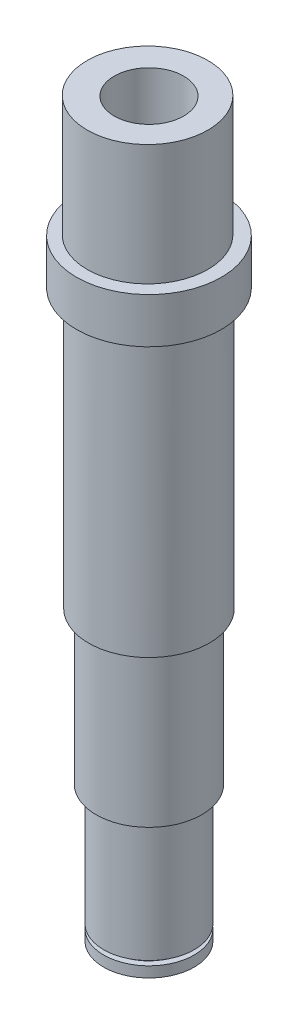
ISO-10303-21;
HEADER;
FILE_DESCRIPTION(('STEP AP214'),'2;1');
FILE_NAME('part.step','',(''),(''),'','','');
FILE_SCHEMA(('AUTOMOTIVE_DESIGN { 1 0 10303 214 1 1 1 1 }'));
ENDSEC;
DATA;
#1=APPLICATION_CONTEXT('core data for automotive mechanical design processes');
#2=APPLICATION_PROTOCOL_DEFINITION('international standard','automotive_design',2000,#1);
#3=PRODUCT_CONTEXT('',#1,'mechanical');
#4=PRODUCT('Part','Part','',(#3));
#5=PRODUCT_RELATED_PRODUCT_CATEGORY('part','',(#4));
#6=PRODUCT_DEFINITION_FORMATION('','',#4);
#7=PRODUCT_DEFINITION_CONTEXT('part definition',#1,'design');
#8=PRODUCT_DEFINITION('design','',#6,#7);
#9=PRODUCT_DEFINITION_SHAPE('','',#8);
#10=(LENGTH_UNIT() NAMED_UNIT(*) SI_UNIT(.MILLI.,.METRE.));
#11=(NAMED_UNIT(*) PLANE_ANGLE_UNIT() SI_UNIT($,.RADIAN.));
#12=(NAMED_UNIT(*) SI_UNIT($,.STERADIAN.) SOLID_ANGLE_UNIT());
#13=UNCERTAINTY_MEASURE_WITH_UNIT(LENGTH_MEASURE(1.E-05),#10,'distance_accuracy_value','');
#14=(GEOMETRIC_REPRESENTATION_CONTEXT(3) GLOBAL_UNCERTAINTY_ASSIGNED_CONTEXT((#13)) GLOBAL_UNIT_ASSIGNED_CONTEXT((#10,
#11,#12)) REPRESENTATION_CONTEXT('',''));
#15=CARTESIAN_POINT('',(0.,0.,0.));
#16=DIRECTION('',(0.,0.,1.));
#17=DIRECTION('',(1.,0.,0.));
#18=AXIS2_PLACEMENT_3D('',#15,#16,#17);
#19=CARTESIAN_POINT('',(0.,142.5,0.));
#20=DIRECTION('',(0.,-1.,0.));
#21=DIRECTION('',(0.,0.,-1.));
#22=AXIS2_PLACEMENT_3D('',#19,#20,#21);
#23=CYLINDRICAL_SURFACE('',#22,20.);
#24=CARTESIAN_POINT('',(0.,142.5,0.));
#25=DIRECTION('',(0.,1.,0.));
#26=DIRECTION('',(0.,0.,1.));
#27=AXIS2_PLACEMENT_3D('',#24,#25,#26);
#28=CIRCLE('',#27,20.);
#29=CARTESIAN_POINT('',(0.,142.5,20.));
#30=VERTEX_POINT('',#29);
#31=EDGE_CURVE('E35',#30,#30,#28,.T.);
#32=ORIENTED_EDGE('',*,*,#31,.F.);
#33=EDGE_LOOP('',(#32));
#34=FACE_BOUND('',#33,.T.);
#35=CARTESIAN_POINT('',(0.,50.5,0.));
#36=DIRECTION('',(0.,-1.,0.));
#37=DIRECTION('',(0.,0.,-1.));
#38=AXIS2_PLACEMENT_3D('',#35,#36,#37);
#39=CIRCLE('',#38,20.);
#40=CARTESIAN_POINT('',(0.,50.5,-20.));
#41=VERTEX_POINT('',#40);
#42=EDGE_CURVE('E89',#41,#41,#39,.T.);
#43=ORIENTED_EDGE('',*,*,#42,.F.);
#44=EDGE_LOOP('',(#43));
#45=FACE_BOUND('',#44,.T.);
#46=ADVANCED_FACE('F32',(#34,#45),#23,.T.);
#47=CARTESIAN_POINT('',(0.,0.,0.));
#48=DIRECTION('',(0.,1.,0.));
#49=DIRECTION('',(0.,0.,1.));
#50=AXIS2_PLACEMENT_3D('',#47,#48,#49);
#51=PLANE('',#50);
#52=CARTESIAN_POINT('',(0.,0.,0.));
#53=DIRECTION('',(0.,-1.,0.));
#54=DIRECTION('',(0.,0.,-1.));
#55=AXIS2_PLACEMENT_3D('',#52,#53,#54);
#56=CIRCLE('',#55,15.);
#57=CARTESIAN_POINT('',(0.,0.,15.));
#58=VERTEX_POINT('',#57);
#59=EDGE_CURVE('E10',#58,#58,#56,.T.);
#60=ORIENTED_EDGE('',*,*,#59,.F.);
#61=EDGE_LOOP('',(#60));
#62=FACE_BOUND('',#61,.T.);
#63=CARTESIAN_POINT('',(0.,0.,0.));
#64=DIRECTION('',(0.,-1.,0.));
#65=DIRECTION('',(0.,0.,-1.));
#66=AXIS2_PLACEMENT_3D('',#63,#64,#65);
#67=CIRCLE('',#66,17.5);
#68=CARTESIAN_POINT('',(0.,0.,-17.5));
#69=VERTEX_POINT('',#68);
#70=EDGE_CURVE('E98',#69,#69,#67,.T.);
#71=ORIENTED_EDGE('',*,*,#70,.T.);
#72=EDGE_LOOP('',(#71));
#73=FACE_BOUND('',#72,.T.);
#74=ADVANCED_FACE('F78',(#62,#73),#51,.F.);
#75=CARTESIAN_POINT('',(0.,-45.,0.));
#76=DIRECTION('',(0.,1.,0.));
#77=DIRECTION('',(0.,0.,1.));
#78=AXIS2_PLACEMENT_3D('',#75,#76,#77);
#79=CYLINDRICAL_SURFACE('',#78,15.);
#80=CARTESIAN_POINT('',(0.,-41.5,0.));
#81=DIRECTION('',(0.,-1.,0.));
#82=DIRECTION('',(0.,0.,-1.));
#83=AXIS2_PLACEMENT_3D('',#80,#81,#82);
#84=CIRCLE('',#83,15.);
#85=CARTESIAN_POINT('',(0.,-41.5,15.));
#86=VERTEX_POINT('',#85);
#87=EDGE_CURVE('E107',#86,#86,#84,.T.);
#88=CARTESIAN_POINT('',(0.,-45.,0.));
#89=DIRECTION('',(0.,-1.,0.));
#90=DIRECTION('',(0.,0.,-1.));
#91=AXIS2_PLACEMENT_3D('',#88,#89,#90);
#92=CIRCLE('',#91,15.);
#93=CARTESIAN_POINT('',(0.,-45.,15.));
#94=VERTEX_POINT('',#93);
#95=EDGE_CURVE('E47',#94,#94,#92,.T.);
#96=CARTESIAN_POINT('',(0.,-41.5,15.));
#97=CARTESIAN_POINT('',(0.,-41.5364583333333,15.));
#98=CARTESIAN_POINT('',(0.,-41.5729166666667,15.));
#99=CARTESIAN_POINT('',(0.,-41.6458333333333,15.));
#100=CARTESIAN_POINT('',(0.,-41.6822916666667,15.));
#101=CARTESIAN_POINT('',(0.,-41.7552083333333,15.));
#102=CARTESIAN_POINT('',(0.,-41.7916666666667,15.));
#103=CARTESIAN_POINT('',(0.,-41.8645833333333,15.));
#104=CARTESIAN_POINT('',(0.,-41.9010416666667,15.));
#105=CARTESIAN_POINT('',(0.,-41.9739583333333,15.));
#106=CARTESIAN_POINT('',(0.,-42.0104166666667,15.));
#107=CARTESIAN_POINT('',(0.,-42.0833333333333,15.));
#108=CARTESIAN_POINT('',(0.,-42.1197916666667,15.));
#109=CARTESIAN_POINT('',(0.,-42.1927083333333,15.));
#110=CARTESIAN_POINT('',(0.,-42.2291666666667,15.));
#111=CARTESIAN_POINT('',(0.,-42.3020833333333,15.));
#112=CARTESIAN_POINT('',(0.,-42.3385416666667,15.));
#113=CARTESIAN_POINT('',(0.,-42.4114583333333,15.));
#114=CARTESIAN_POINT('',(0.,-42.4479166666667,15.));
#115=CARTESIAN_POINT('',(0.,-42.5208333333333,15.));
#116=CARTESIAN_POINT('',(0.,-42.5572916666667,15.));
#117=CARTESIAN_POINT('',(0.,-42.6302083333333,15.));
#118=CARTESIAN_POINT('',(0.,-42.6666666666667,15.));
#119=CARTESIAN_POINT('',(0.,-42.7395833333333,15.));
#120=CARTESIAN_POINT('',(0.,-42.7760416666667,15.));
#121=CARTESIAN_POINT('',(0.,-42.8489583333333,15.));
#122=CARTESIAN_POINT('',(0.,-42.8854166666667,15.));
#123=CARTESIAN_POINT('',(0.,-42.9583333333333,15.));
#124=CARTESIAN_POINT('',(0.,-42.9947916666667,15.));
#125=CARTESIAN_POINT('',(0.,-43.0677083333333,15.));
#126=CARTESIAN_POINT('',(0.,-43.1041666666667,15.));
#127=CARTESIAN_POINT('',(0.,-43.1770833333333,15.));
#128=CARTESIAN_POINT('',(0.,-43.2135416666667,15.));
#129=CARTESIAN_POINT('',(0.,-43.2864583333333,15.));
#130=CARTESIAN_POINT('',(0.,-43.3229166666667,15.));
#131=CARTESIAN_POINT('',(0.,-43.3958333333333,15.));
#132=CARTESIAN_POINT('',(0.,-43.4322916666667,15.));
#133=CARTESIAN_POINT('',(0.,-43.5052083333333,15.));
#134=CARTESIAN_POINT('',(0.,-43.5416666666667,15.));
#135=CARTESIAN_POINT('',(0.,-43.6145833333333,15.));
#136=CARTESIAN_POINT('',(0.,-43.6510416666667,15.));
#137=CARTESIAN_POINT('',(0.,-43.7239583333333,15.));
#138=CARTESIAN_POINT('',(0.,-43.7604166666667,15.));
#139=CARTESIAN_POINT('',(0.,-43.8333333333333,15.));
#140=CARTESIAN_POINT('',(0.,-43.8697916666667,15.));
#141=CARTESIAN_POINT('',(0.,-43.9427083333333,15.));
#142=CARTESIAN_POINT('',(0.,-43.9791666666667,15.));
#143=CARTESIAN_POINT('',(0.,-44.0520833333333,15.));
#144=CARTESIAN_POINT('',(0.,-44.0885416666667,15.));
#145=CARTESIAN_POINT('',(0.,-44.1614583333333,15.));
#146=CARTESIAN_POINT('',(0.,-44.1979166666667,15.));
#147=CARTESIAN_POINT('',(0.,-44.2708333333333,15.));
#148=CARTESIAN_POINT('',(0.,-44.3072916666667,15.));
#149=CARTESIAN_POINT('',(0.,-44.3802083333333,15.));
#150=CARTESIAN_POINT('',(0.,-44.4166666666667,15.));
#151=CARTESIAN_POINT('',(0.,-44.4895833333333,15.));
#152=CARTESIAN_POINT('',(0.,-44.5260416666667,15.));
#153=CARTESIAN_POINT('',(0.,-44.5989583333333,15.));
#154=CARTESIAN_POINT('',(0.,-44.6354166666667,15.));
#155=CARTESIAN_POINT('',(0.,-44.7083333333333,15.));
#156=CARTESIAN_POINT('',(0.,-44.7447916666667,15.));
#157=CARTESIAN_POINT('',(0.,-44.8177083333333,15.));
#158=CARTESIAN_POINT('',(0.,-44.8541666666667,15.));
#159=CARTESIAN_POINT('',(0.,-44.9270833333333,15.));
#160=CARTESIAN_POINT('',(0.,-44.9635416666667,15.));
#161=CARTESIAN_POINT('',(0.,-45.,15.));
#162=B_SPLINE_CURVE_WITH_KNOTS('',3,(#96,#97,#98,#99,#100,#101,#102,#103,#104,#105,#106,#107,
#108,#109,#110,#111,#112,#113,#114,#115,#116,#117,#118,#119,#120,#121,#122,#123,#124,#125,#126,
#127,#128,#129,#130,#131,#132,#133,#134,#135,#136,#137,#138,#139,#140,#141,#142,#143,#144,#145,
#146,#147,#148,#149,#150,#151,#152,#153,#154,#155,#156,#157,#158,#159,#160,#161),.UNSPECIFIED.,
.F.,.F.,(4,2,2,2,2,2,2,2,2,2,2,2,2,2,2,2,2,2,2,2,2,2,2,2,2,2,2,2,2,2,2,2,4),(0.,
0.109375000000002,0.218750000000004,0.328125000000005,0.4375,0.546875000000002,
0.656250000000004,0.765625000000006,0.875000000000001,0.984375000000003,1.09375,
1.20312500000001,1.3125,1.421875,1.53125,1.64062500000001,1.75,1.859375,1.96875000000001,
2.07812500000001,2.1875,2.296875,2.40625000000001,2.51562500000001,2.62500000000001,2.734375,
2.84375000000001,2.95312500000001,3.06250000000001,3.171875,3.28125000000001,3.39062500000001,
3.50000000000001),.UNSPECIFIED.);
#163=EDGE_CURVE('BSEAM83',#86,#94,#162,.T.);
#164=ORIENTED_EDGE('',*,*,#87,.T.);
#165=ORIENTED_EDGE('',*,*,#95,.F.);
#166=ORIENTED_EDGE('',*,*,#163,.T.);
#167=ORIENTED_EDGE('',*,*,#163,.F.);
#168=EDGE_LOOP('',(#164,#166,#165,#167));
#169=FACE_BOUND('',#168,.T.);
#170=ADVANCED_FACE('F83',(#169),#79,.T.);
#171=CARTESIAN_POINT('',(0.,157.5,0.));
#172=DIRECTION('',(0.,-1.,0.));
#173=DIRECTION('',(0.,0.,-1.));
#174=AXIS2_PLACEMENT_3D('',#171,#172,#173);
#175=CYLINDRICAL_SURFACE('',#174,24.);
#176=CARTESIAN_POINT('',(0.,157.5,0.));
#177=DIRECTION('',(0.,1.,0.));
#178=DIRECTION('',(0.,0.,1.));
#179=AXIS2_PLACEMENT_3D('',#176,#177,#178);
#180=CIRCLE('',#179,24.);
#181=CARTESIAN_POINT('',(0.,157.5,24.));
#182=VERTEX_POINT('',#181);
#183=EDGE_CURVE('E53',#182,#182,#180,.T.);
#184=ORIENTED_EDGE('',*,*,#183,.F.);
#185=EDGE_LOOP('',(#184));
#186=FACE_BOUND('',#185,.T.);
#187=CARTESIAN_POINT('',(0.,142.5,0.));
#188=DIRECTION('',(0.,1.,0.));
#189=DIRECTION('',(0.,0.,1.));
#190=AXIS2_PLACEMENT_3D('',#187,#188,#189);
#191=CIRCLE('',#190,24.);
#192=CARTESIAN_POINT('',(0.,142.5,24.));
#193=VERTEX_POINT('',#192);
#194=EDGE_CURVE('E51',#193,#193,#191,.T.);
#195=ORIENTED_EDGE('',*,*,#194,.T.);
#196=EDGE_LOOP('',(#195));
#197=FACE_BOUND('',#196,.T.);
#198=ADVANCED_FACE('F58',(#186,#197),#175,.T.);
#199=CARTESIAN_POINT('',(0.,157.5,0.));
#200=DIRECTION('',(0.,1.,0.));
#201=DIRECTION('',(0.,0.,1.));
#202=AXIS2_PLACEMENT_3D('',#199,#200,#201);
#203=PLANE('',#202);
#204=CARTESIAN_POINT('',(-0.463755605427885,157.5,0.));
#205=DIRECTION('',(0.,1.,0.));
#206=DIRECTION('',(0.,0.,1.));
#207=AXIS2_PLACEMENT_3D('',#204,#205,#206);
#208=CIRCLE('',#207,20.);
#209=CARTESIAN_POINT('',(-0.463755605427885,157.5,20.));
#210=VERTEX_POINT('',#209);
#211=EDGE_CURVE('E39',#210,#210,#208,.T.);
#212=ORIENTED_EDGE('',*,*,#211,.F.);
#213=EDGE_LOOP('',(#212));
#214=FACE_BOUND('',#213,.T.);
#215=ORIENTED_EDGE('',*,*,#183,.T.);
#216=EDGE_LOOP('',(#215));
#217=FACE_BOUND('',#216,.T.);
#218=ADVANCED_FACE('F63',(#214,#217),#203,.T.);
#219=CARTESIAN_POINT('',(0.,142.5,0.));
#220=DIRECTION('',(0.,1.,0.));
#221=DIRECTION('',(0.,0.,1.));
#222=AXIS2_PLACEMENT_3D('',#219,#220,#221);
#223=PLANE('',#222);
#224=ORIENTED_EDGE('',*,*,#31,.T.);
#225=EDGE_LOOP('',(#224));
#226=FACE_BOUND('',#225,.T.);
#227=ORIENTED_EDGE('',*,*,#194,.F.);
#228=EDGE_LOOP('',(#227));
#229=FACE_BOUND('',#228,.T.);
#230=ADVANCED_FACE('F60',(#226,#229),#223,.F.);
#231=CARTESIAN_POINT('',(-0.463755605427885,197.5,0.));
#232=DIRECTION('',(0.,-1.,0.));
#233=DIRECTION('',(0.,0.,-1.));
#234=AXIS2_PLACEMENT_3D('',#231,#232,#233);
#235=CYLINDRICAL_SURFACE('',#234,20.);
#236=CARTESIAN_POINT('',(-0.463755605427885,197.5,0.));
#237=DIRECTION('',(0.,1.,0.));
#238=DIRECTION('',(0.,0.,1.));
#239=AXIS2_PLACEMENT_3D('',#236,#237,#238);
#240=CIRCLE('',#239,20.);
#241=CARTESIAN_POINT('',(-0.463755605427885,197.5,20.));
#242=VERTEX_POINT('',#241);
#243=EDGE_CURVE('E49',#242,#242,#240,.T.);
#244=ORIENTED_EDGE('',*,*,#243,.F.);
#245=EDGE_LOOP('',(#244));
#246=FACE_BOUND('',#245,.T.);
#247=ORIENTED_EDGE('',*,*,#211,.T.);
#248=EDGE_LOOP('',(#247));
#249=FACE_BOUND('',#248,.T.);
#250=ADVANCED_FACE('F62',(#246,#249),#235,.T.);
#251=CARTESIAN_POINT('',(-0.463755605427885,197.5,0.));
#252=DIRECTION('',(0.,1.,0.));
#253=DIRECTION('',(0.,0.,1.));
#254=AXIS2_PLACEMENT_3D('',#251,#252,#253);
#255=PLANE('',#254);
#256=CARTESIAN_POINT('',(0.,197.5,0.));
#257=DIRECTION('',(0.,1.,0.));
#258=DIRECTION('',(0.,0.,1.));
#259=AXIS2_PLACEMENT_3D('',#256,#257,#258);
#260=CIRCLE('',#259,11.5);
#261=CARTESIAN_POINT('',(0.,197.5,11.5));
#262=VERTEX_POINT('',#261);
#263=EDGE_CURVE('E112',#262,#262,#260,.T.);
#264=ORIENTED_EDGE('',*,*,#263,.F.);
#265=EDGE_LOOP('',(#264));
#266=FACE_BOUND('',#265,.T.);
#267=ORIENTED_EDGE('',*,*,#243,.T.);
#268=EDGE_LOOP('',(#267));
#269=FACE_BOUND('',#268,.T.);
#270=ADVANCED_FACE('F70',(#266,#269),#255,.T.);
#271=CARTESIAN_POINT('',(0.,-40.,0.));
#272=DIRECTION('',(0.,-1.,0.));
#273=DIRECTION('',(0.,0.,-1.));
#274=AXIS2_PLACEMENT_3D('',#271,#272,#273);
#275=CIRCLE('',#274,15.);
#276=CARTESIAN_POINT('',(0.,-40.,15.));
#277=VERTEX_POINT('',#276);
#278=EDGE_CURVE('E91',#277,#277,#275,.T.);
#279=CARTESIAN_POINT('',(0.,-40.,15.));
#280=CARTESIAN_POINT('',(0.,-39.5833333333333,15.));
#281=CARTESIAN_POINT('',(0.,-39.1666666666667,15.));
#282=CARTESIAN_POINT('',(0.,-38.3333333333333,15.));
#283=CARTESIAN_POINT('',(0.,-37.9166666666667,15.));
#284=CARTESIAN_POINT('',(0.,-37.0833333333333,15.));
#285=CARTESIAN_POINT('',(0.,-36.6666666666667,15.));
#286=CARTESIAN_POINT('',(0.,-35.8333333333333,15.));
#287=CARTESIAN_POINT('',(0.,-35.4166666666667,15.));
#288=CARTESIAN_POINT('',(0.,-34.5833333333333,15.));
#289=CARTESIAN_POINT('',(0.,-34.1666666666667,15.));
#290=CARTESIAN_POINT('',(0.,-33.3333333333333,15.));
#291=CARTESIAN_POINT('',(0.,-32.9166666666667,15.));
#292=CARTESIAN_POINT('',(0.,-32.0833333333333,15.));
#293=CARTESIAN_POINT('',(0.,-31.6666666666667,15.));
#294=CARTESIAN_POINT('',(0.,-30.8333333333333,15.));
#295=CARTESIAN_POINT('',(0.,-30.4166666666667,15.));
#296=CARTESIAN_POINT('',(0.,-29.5833333333333,15.));
#297=CARTESIAN_POINT('',(0.,-29.1666666666667,15.));
#298=CARTESIAN_POINT('',(0.,-28.3333333333333,15.));
#299=CARTESIAN_POINT('',(0.,-27.9166666666667,15.));
#300=CARTESIAN_POINT('',(0.,-27.0833333333333,15.));
#301=CARTESIAN_POINT('',(0.,-26.6666666666667,15.));
#302=CARTESIAN_POINT('',(0.,-25.8333333333333,15.));
#303=CARTESIAN_POINT('',(0.,-25.4166666666667,15.));
#304=CARTESIAN_POINT('',(0.,-24.5833333333333,15.));
#305=CARTESIAN_POINT('',(0.,-24.1666666666667,15.));
#306=CARTESIAN_POINT('',(0.,-23.3333333333333,15.));
#307=CARTESIAN_POINT('',(0.,-22.9166666666667,15.));
#308=CARTESIAN_POINT('',(0.,-22.0833333333333,15.));
#309=CARTESIAN_POINT('',(0.,-21.6666666666667,15.));
#310=CARTESIAN_POINT('',(0.,-20.8333333333333,15.));
#311=CARTESIAN_POINT('',(0.,-20.4166666666667,15.));
#312=CARTESIAN_POINT('',(0.,-19.5833333333333,15.));
#313=CARTESIAN_POINT('',(0.,-19.1666666666667,15.));
#314=CARTESIAN_POINT('',(0.,-18.3333333333333,15.));
#315=CARTESIAN_POINT('',(0.,-17.9166666666667,15.));
#316=CARTESIAN_POINT('',(0.,-17.0833333333333,15.));
#317=CARTESIAN_POINT('',(0.,-16.6666666666667,15.));
#318=CARTESIAN_POINT('',(0.,-15.8333333333333,15.));
#319=CARTESIAN_POINT('',(0.,-15.4166666666667,15.));
#320=CARTESIAN_POINT('',(0.,-14.5833333333333,15.));
#321=CARTESIAN_POINT('',(0.,-14.1666666666667,15.));
#322=CARTESIAN_POINT('',(0.,-13.3333333333333,15.));
#323=CARTESIAN_POINT('',(0.,-12.9166666666667,15.));
#324=CARTESIAN_POINT('',(0.,-12.0833333333333,15.));
#325=CARTESIAN_POINT('',(0.,-11.6666666666667,15.));
#326=CARTESIAN_POINT('',(0.,-10.8333333333333,15.));
#327=CARTESIAN_POINT('',(0.,-10.4166666666667,15.));
#328=CARTESIAN_POINT('',(0.,-9.58333333333333,15.));
#329=CARTESIAN_POINT('',(0.,-9.16666666666667,15.));
#330=CARTESIAN_POINT('',(0.,-8.33333333333333,15.));
#331=CARTESIAN_POINT('',(0.,-7.91666666666667,15.));
#332=CARTESIAN_POINT('',(0.,-7.08333333333333,15.));
#333=CARTESIAN_POINT('',(0.,-6.66666666666667,15.));
#334=CARTESIAN_POINT('',(0.,-5.83333333333333,15.));
#335=CARTESIAN_POINT('',(0.,-5.41666666666666,15.));
#336=CARTESIAN_POINT('',(0.,-4.58333333333333,15.));
#337=CARTESIAN_POINT('',(0.,-4.16666666666666,15.));
#338=CARTESIAN_POINT('',(0.,-3.33333333333333,15.));
#339=CARTESIAN_POINT('',(0.,-2.91666666666666,15.));
#340=CARTESIAN_POINT('',(0.,-2.08333333333333,15.));
#341=CARTESIAN_POINT('',(0.,-1.66666666666666,15.));
#342=CARTESIAN_POINT('',(0.,-0.833333333333327,15.));
#343=CARTESIAN_POINT('',(0.,-0.41666666666666,15.));
#344=CARTESIAN_POINT('',(0.,0.,15.));
#345=B_SPLINE_CURVE_WITH_KNOTS('',3,(#279,#280,#281,#282,#283,#284,#285,#286,#287,#288,#289,
#290,#291,#292,#293,#294,#295,#296,#297,#298,#299,#300,#301,#302,#303,#304,#305,#306,#307,#308,
#309,#310,#311,#312,#313,#314,#315,#316,#317,#318,#319,#320,#321,#322,#323,#324,#325,#326,#327,
#328,#329,#330,#331,#332,#333,#334,#335,#336,#337,#338,#339,#340,#341,#342,#343,#344),
.UNSPECIFIED.,.F.,.F.,(4,2,2,2,2,2,2,2,2,2,2,2,2,2,2,2,2,2,2,2,2,2,2,2,2,2,2,2,2,2,2,2,4),(0.,
1.25,2.5,3.75,5.,6.25000000000001,7.5,8.75,10.,11.25,12.5,13.75,15.,16.25,17.5,18.75,20.,21.25,
22.5,23.75,25.,26.25,27.5,28.75,30.,31.25,32.5,33.75,35.,36.25,37.5,38.75,40.),.UNSPECIFIED.);
#346=EDGE_CURVE('BSEAM124',#277,#58,#345,.T.);
#347=ORIENTED_EDGE('',*,*,#278,.F.);
#348=ORIENTED_EDGE('',*,*,#59,.T.);
#349=ORIENTED_EDGE('',*,*,#346,.T.);
#350=ORIENTED_EDGE('',*,*,#346,.F.);
#351=EDGE_LOOP('',(#347,#349,#348,#350));
#352=FACE_BOUND('',#351,.T.);
#353=ADVANCED_FACE('F124',(#352),#79,.T.);
#354=CARTESIAN_POINT('',(0.,-45.,0.));
#355=DIRECTION('',(0.,-1.,0.));
#356=DIRECTION('',(0.,0.,-1.));
#357=AXIS2_PLACEMENT_3D('',#354,#355,#356);
#358=PLANE('',#357);
#359=CARTESIAN_POINT('',(0.,-45.,0.));
#360=DIRECTION('',(0.,1.,0.));
#361=DIRECTION('',(0.,0.,1.));
#362=AXIS2_PLACEMENT_3D('',#359,#360,#361);
#363=CIRCLE('',#362,11.5);
#364=CARTESIAN_POINT('',(0.,-45.,11.5));
#365=VERTEX_POINT('',#364);
#366=EDGE_CURVE('E110',#365,#365,#363,.T.);
#367=ORIENTED_EDGE('',*,*,#366,.T.);
#368=EDGE_LOOP('',(#367));
#369=FACE_BOUND('',#368,.T.);
#370=ORIENTED_EDGE('',*,*,#95,.T.);
#371=EDGE_LOOP('',(#370));
#372=FACE_BOUND('',#371,.T.);
#373=ADVANCED_FACE('F119',(#369,#372),#358,.T.);
#374=CARTESIAN_POINT('',(0.,-45.,0.));
#375=DIRECTION('',(0.,1.,0.));
#376=DIRECTION('',(0.,0.,1.));
#377=AXIS2_PLACEMENT_3D('',#374,#375,#376);
#378=CYLINDRICAL_SURFACE('',#377,11.5);
#379=ORIENTED_EDGE('',*,*,#263,.T.);
#380=EDGE_LOOP('',(#379));
#381=FACE_BOUND('',#380,.T.);
#382=ORIENTED_EDGE('',*,*,#366,.F.);
#383=EDGE_LOOP('',(#382));
#384=FACE_BOUND('',#383,.T.);
#385=ADVANCED_FACE('F137',(#381,#384),#378,.F.);
#386=CARTESIAN_POINT('',(0.,-41.5,-15.));
#387=DIRECTION('',(0.,-1.,0.));
#388=DIRECTION('',(0.,0.,-1.));
#389=AXIS2_PLACEMENT_3D('',#386,#387,#388);
#390=PLANE('',#389);
#391=ORIENTED_EDGE('',*,*,#87,.F.);
#392=EDGE_LOOP('',(#391));
#393=FACE_BOUND('',#392,.T.);
#394=CARTESIAN_POINT('',(0.,-41.5,0.));
#395=DIRECTION('',(0.,-1.,0.));
#396=DIRECTION('',(0.,0.,-1.));
#397=AXIS2_PLACEMENT_3D('',#394,#395,#396);
#398=CIRCLE('',#397,13.);
#399=CARTESIAN_POINT('',(0.,-41.5,-13.));
#400=VERTEX_POINT('',#399);
#401=EDGE_CURVE('E104',#400,#400,#398,.T.);
#402=ORIENTED_EDGE('',*,*,#401,.T.);
#403=EDGE_LOOP('',(#402));
#404=FACE_BOUND('',#403,.T.);
#405=ADVANCED_FACE('F154',(#393,#404),#390,.F.);
#406=CARTESIAN_POINT('',(0.,-40.1309310173867,0.));
#407=DIRECTION('',(0.,-1.,0.));
#408=DIRECTION('',(0.,0.,-1.));
#409=AXIS2_PLACEMENT_3D('',#406,#407,#408);
#410=CYLINDRICAL_SURFACE('',#409,13.);
#411=ORIENTED_EDGE('',*,*,#401,.F.);
#412=EDGE_LOOP('',(#411));
#413=FACE_BOUND('',#412,.T.);
#414=CARTESIAN_POINT('',(0.,-40.,0.));
#415=DIRECTION('',(0.,-1.,0.));
#416=DIRECTION('',(0.,0.,-1.));
#417=AXIS2_PLACEMENT_3D('',#414,#415,#416);
#418=CIRCLE('',#417,13.);
#419=CARTESIAN_POINT('',(0.,-40.,-13.));
#420=VERTEX_POINT('',#419);
#421=EDGE_CURVE('E95',#420,#420,#418,.T.);
#422=ORIENTED_EDGE('',*,*,#421,.T.);
#423=EDGE_LOOP('',(#422));
#424=FACE_BOUND('',#423,.T.);
#425=ADVANCED_FACE('F145',(#413,#424),#410,.T.);
#426=CARTESIAN_POINT('',(0.,-40.,-15.));
#427=DIRECTION('',(0.,1.,0.));
#428=DIRECTION('',(0.,0.,1.));
#429=AXIS2_PLACEMENT_3D('',#426,#427,#428);
#430=PLANE('',#429);
#431=ORIENTED_EDGE('',*,*,#421,.F.);
#432=EDGE_LOOP('',(#431));
#433=FACE_BOUND('',#432,.T.);
#434=ORIENTED_EDGE('',*,*,#278,.T.);
#435=EDGE_LOOP('',(#434));
#436=FACE_BOUND('',#435,.T.);
#437=ADVANCED_FACE('F142',(#433,#436),#430,.F.);
#438=CARTESIAN_POINT('',(-20.,50.5,0.));
#439=DIRECTION('',(0.,-1.,0.));
#440=DIRECTION('',(0.,0.,-1.));
#441=AXIS2_PLACEMENT_3D('',#438,#439,#440);
#442=PLANE('',#441);
#443=ORIENTED_EDGE('',*,*,#42,.T.);
#444=EDGE_LOOP('',(#443));
#445=FACE_BOUND('',#444,.T.);
#446=CARTESIAN_POINT('',(0.,50.5,0.));
#447=DIRECTION('',(0.,-1.,0.));
#448=DIRECTION('',(0.,0.,-1.));
#449=AXIS2_PLACEMENT_3D('',#446,#447,#448);
#450=CIRCLE('',#449,17.5);
#451=CARTESIAN_POINT('',(0.,50.5,-17.5));
#452=VERTEX_POINT('',#451);
#453=EDGE_CURVE('E92',#452,#452,#450,.T.);
#454=ORIENTED_EDGE('',*,*,#453,.F.);
#455=EDGE_LOOP('',(#454));
#456=FACE_BOUND('',#455,.T.);
#457=ADVANCED_FACE('F144',(#445,#456),#442,.T.);
#458=CARTESIAN_POINT('',(0.,-22.1683961326908,0.));
#459=DIRECTION('',(0.,-1.,0.));
#460=DIRECTION('',(0.,0.,-1.));
#461=AXIS2_PLACEMENT_3D('',#458,#459,#460);
#462=CYLINDRICAL_SURFACE('',#461,17.5);
#463=ORIENTED_EDGE('',*,*,#453,.T.);
#464=EDGE_LOOP('',(#463));
#465=FACE_BOUND('',#464,.T.);
#466=ORIENTED_EDGE('',*,*,#70,.F.);
#467=EDGE_LOOP('',(#466));
#468=FACE_BOUND('',#467,.T.);
#469=ADVANCED_FACE('F152',(#465,#468),#462,.T.);
#470=CLOSED_SHELL('',(#46,#74,#170,#198,#218,#230,#250,#270,#353,#373,#385,#405,#425,#437,#457,#469));
#471=MANIFOLD_SOLID_BREP('B2',#470);
#472=ADVANCED_BREP_SHAPE_REPRESENTATION('',(#18,#471),#14);
#473=SHAPE_DEFINITION_REPRESENTATION(#9,#472);
ENDSEC;
END-ISO-10303-21;
